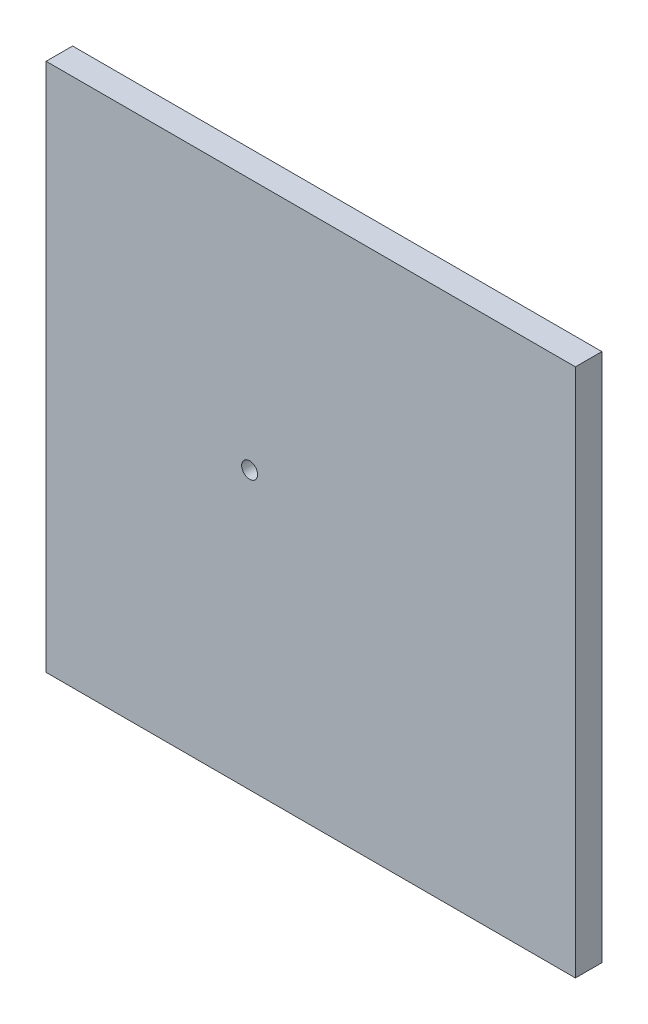
ISO-10303-21;
HEADER;
FILE_DESCRIPTION(('STEP AP214'),'2;1');
FILE_NAME('part.step','',(''),(''),'','','');
FILE_SCHEMA(('AUTOMOTIVE_DESIGN { 1 0 10303 214 1 1 1 1 }'));
ENDSEC;
DATA;
#1=APPLICATION_CONTEXT('core data for automotive mechanical design processes');
#2=APPLICATION_PROTOCOL_DEFINITION('international standard','automotive_design',2000,#1);
#3=PRODUCT_CONTEXT('',#1,'mechanical');
#4=PRODUCT('Part','Part','',(#3));
#5=PRODUCT_RELATED_PRODUCT_CATEGORY('part','',(#4));
#6=PRODUCT_DEFINITION_FORMATION('','',#4);
#7=PRODUCT_DEFINITION_CONTEXT('part definition',#1,'design');
#8=PRODUCT_DEFINITION('design','',#6,#7);
#9=PRODUCT_DEFINITION_SHAPE('','',#8);
#10=(LENGTH_UNIT() NAMED_UNIT(*) SI_UNIT(.MILLI.,.METRE.));
#11=(NAMED_UNIT(*) PLANE_ANGLE_UNIT() SI_UNIT($,.RADIAN.));
#12=(NAMED_UNIT(*) SI_UNIT($,.STERADIAN.) SOLID_ANGLE_UNIT());
#13=UNCERTAINTY_MEASURE_WITH_UNIT(LENGTH_MEASURE(1.E-05),#10,'distance_accuracy_value','');
#14=(GEOMETRIC_REPRESENTATION_CONTEXT(3) GLOBAL_UNCERTAINTY_ASSIGNED_CONTEXT((#13)) GLOBAL_UNIT_ASSIGNED_CONTEXT((#10,
#11,#12)) REPRESENTATION_CONTEXT('',''));
#15=CARTESIAN_POINT('',(0.,0.,0.));
#16=DIRECTION('',(0.,0.,1.));
#17=DIRECTION('',(1.,0.,0.));
#18=AXIS2_PLACEMENT_3D('',#15,#16,#17);
#19=CARTESIAN_POINT('',(127.,-127.,12.7));
#20=DIRECTION('',(-1.,0.,0.));
#21=DIRECTION('',(0.,0.,1.));
#22=AXIS2_PLACEMENT_3D('',#19,#20,#21);
#23=PLANE('',#22);
#24=DIRECTION('',(0.,1.,0.));
#25=VECTOR('',#24,1.);
#26=CARTESIAN_POINT('',(127.,-127.,0.));
#27=LINE('',#26,#25);
#28=CARTESIAN_POINT('',(127.,-127.,0.));
#29=VERTEX_POINT('',#28);
#30=CARTESIAN_POINT('',(127.,127.,0.));
#31=VERTEX_POINT('',#30);
#32=EDGE_CURVE('E112',#29,#31,#27,.T.);
#33=ORIENTED_EDGE('',*,*,#32,.T.);
#34=DIRECTION('',(0.,0.,-1.));
#35=VECTOR('',#34,1.);
#36=CARTESIAN_POINT('',(127.,127.,12.7));
#37=LINE('',#36,#35);
#38=CARTESIAN_POINT('',(127.,127.,12.7));
#39=VERTEX_POINT('',#38);
#40=EDGE_CURVE('E11',#39,#31,#37,.T.);
#41=ORIENTED_EDGE('',*,*,#40,.F.);
#42=DIRECTION('',(0.,1.,0.));
#43=VECTOR('',#42,1.);
#44=CARTESIAN_POINT('',(127.,-127.,12.7));
#45=LINE('',#44,#43);
#46=CARTESIAN_POINT('',(127.,-127.,12.7));
#47=VERTEX_POINT('',#46);
#48=EDGE_CURVE('E96',#47,#39,#45,.T.);
#49=ORIENTED_EDGE('',*,*,#48,.F.);
#50=DIRECTION('',(0.,0.,-1.));
#51=VECTOR('',#50,1.);
#52=CARTESIAN_POINT('',(127.,-127.,12.7));
#53=LINE('',#52,#51);
#54=EDGE_CURVE('E108',#47,#29,#53,.T.);
#55=ORIENTED_EDGE('',*,*,#54,.T.);
#56=EDGE_LOOP('',(#33,#41,#49,#55));
#57=FACE_BOUND('',#56,.T.);
#58=ADVANCED_FACE('F44',(#57),#23,.F.);
#59=CARTESIAN_POINT('',(-127.,127.,12.7));
#60=DIRECTION('',(0.,-1.,0.));
#61=DIRECTION('',(0.,0.,-1.));
#62=AXIS2_PLACEMENT_3D('',#59,#60,#61);
#63=PLANE('',#62);
#64=DIRECTION('',(-1.,0.,0.));
#65=VECTOR('',#64,1.);
#66=CARTESIAN_POINT('',(-127.,127.,0.));
#67=LINE('',#66,#65);
#68=CARTESIAN_POINT('',(-127.,127.,0.));
#69=VERTEX_POINT('',#68);
#70=EDGE_CURVE('E101',#31,#69,#67,.T.);
#71=ORIENTED_EDGE('',*,*,#70,.T.);
#72=DIRECTION('',(0.,0.,-1.));
#73=VECTOR('',#72,1.);
#74=CARTESIAN_POINT('',(-127.,127.,12.7));
#75=LINE('',#74,#73);
#76=CARTESIAN_POINT('',(-127.,127.,12.7));
#77=VERTEX_POINT('',#76);
#78=EDGE_CURVE('E53',#77,#69,#75,.T.);
#79=ORIENTED_EDGE('',*,*,#78,.F.);
#80=DIRECTION('',(-1.,0.,0.));
#81=VECTOR('',#80,1.);
#82=CARTESIAN_POINT('',(-127.,127.,12.7));
#83=LINE('',#82,#81);
#84=EDGE_CURVE('E91',#39,#77,#83,.T.);
#85=ORIENTED_EDGE('',*,*,#84,.F.);
#86=ORIENTED_EDGE('',*,*,#40,.T.);
#87=EDGE_LOOP('',(#71,#79,#85,#86));
#88=FACE_BOUND('',#87,.T.);
#89=ADVANCED_FACE('F100',(#88),#63,.F.);
#90=CARTESIAN_POINT('',(-127.,-127.,12.7));
#91=DIRECTION('',(1.,0.,0.));
#92=DIRECTION('',(0.,0.,-1.));
#93=AXIS2_PLACEMENT_3D('',#90,#91,#92);
#94=PLANE('',#93);
#95=DIRECTION('',(0.,-1.,0.));
#96=VECTOR('',#95,1.);
#97=CARTESIAN_POINT('',(-127.,-127.,0.));
#98=LINE('',#97,#96);
#99=CARTESIAN_POINT('',(-127.,-127.,0.));
#100=VERTEX_POINT('',#99);
#101=EDGE_CURVE('E78',#69,#100,#98,.T.);
#102=ORIENTED_EDGE('',*,*,#101,.T.);
#103=DIRECTION('',(0.,0.,-1.));
#104=VECTOR('',#103,1.);
#105=CARTESIAN_POINT('',(-127.,-127.,12.7));
#106=LINE('',#105,#104);
#107=CARTESIAN_POINT('',(-127.,-127.,12.7));
#108=VERTEX_POINT('',#107);
#109=EDGE_CURVE('E103',#108,#100,#106,.T.);
#110=ORIENTED_EDGE('',*,*,#109,.F.);
#111=DIRECTION('',(0.,-1.,0.));
#112=VECTOR('',#111,1.);
#113=CARTESIAN_POINT('',(-127.,-127.,12.7));
#114=LINE('',#113,#112);
#115=EDGE_CURVE('E94',#77,#108,#114,.T.);
#116=ORIENTED_EDGE('',*,*,#115,.F.);
#117=ORIENTED_EDGE('',*,*,#78,.T.);
#118=EDGE_LOOP('',(#102,#110,#116,#117));
#119=FACE_BOUND('',#118,.T.);
#120=ADVANCED_FACE('F104',(#119),#94,.F.);
#121=CARTESIAN_POINT('',(-127.,-127.,12.7));
#122=DIRECTION('',(0.,1.,0.));
#123=DIRECTION('',(0.,0.,1.));
#124=AXIS2_PLACEMENT_3D('',#121,#122,#123);
#125=PLANE('',#124);
#126=DIRECTION('',(1.,0.,0.));
#127=VECTOR('',#126,1.);
#128=CARTESIAN_POINT('',(-127.,-127.,0.));
#129=LINE('',#128,#127);
#130=EDGE_CURVE('E84',#100,#29,#129,.T.);
#131=ORIENTED_EDGE('',*,*,#130,.T.);
#132=ORIENTED_EDGE('',*,*,#54,.F.);
#133=DIRECTION('',(1.,0.,0.));
#134=VECTOR('',#133,1.);
#135=CARTESIAN_POINT('',(-127.,-127.,12.7));
#136=LINE('',#135,#134);
#137=EDGE_CURVE('E61',#108,#47,#136,.T.);
#138=ORIENTED_EDGE('',*,*,#137,.F.);
#139=ORIENTED_EDGE('',*,*,#109,.T.);
#140=EDGE_LOOP('',(#131,#132,#138,#139));
#141=FACE_BOUND('',#140,.T.);
#142=ADVANCED_FACE('F126',(#141),#125,.F.);
#143=CARTESIAN_POINT('',(0.,0.,12.7));
#144=DIRECTION('',(0.,0.,-1.));
#145=DIRECTION('',(-1.,0.,0.));
#146=AXIS2_PLACEMENT_3D('',#143,#144,#145);
#147=PLANE('',#146);
#148=CARTESIAN_POINT('',(-29.3427851968542,5.95360859066609,12.7));
#149=DIRECTION('',(0.,0.,1.));
#150=DIRECTION('',(1.,0.,0.));
#151=AXIS2_PLACEMENT_3D('',#148,#149,#150);
#152=CIRCLE('',#151,3.82731980828535);
#153=CARTESIAN_POINT('',(-25.5154653885688,5.95360859066609,12.7));
#154=VERTEX_POINT('',#153);
#155=EDGE_CURVE('E133',#154,#154,#152,.T.);
#156=ORIENTED_EDGE('',*,*,#155,.F.);
#157=EDGE_LOOP('',(#156));
#158=FACE_BOUND('',#157,.T.);
#159=ORIENTED_EDGE('',*,*,#48,.T.);
#160=ORIENTED_EDGE('',*,*,#84,.T.);
#161=ORIENTED_EDGE('',*,*,#115,.T.);
#162=ORIENTED_EDGE('',*,*,#137,.T.);
#163=EDGE_LOOP('',(#159,#160,#161,#162));
#164=FACE_BOUND('',#163,.T.);
#165=ADVANCED_FACE('F92',(#158,#164),#147,.F.);
#166=CARTESIAN_POINT('',(0.,0.,0.));
#167=DIRECTION('',(0.,0.,-1.));
#168=DIRECTION('',(-1.,0.,0.));
#169=AXIS2_PLACEMENT_3D('',#166,#167,#168);
#170=PLANE('',#169);
#171=CARTESIAN_POINT('',(-29.3427851968542,5.95360859066609,0.));
#172=DIRECTION('',(0.,0.,1.));
#173=DIRECTION('',(1.,0.,0.));
#174=AXIS2_PLACEMENT_3D('',#171,#172,#173);
#175=CIRCLE('',#174,3.82731980828535);
#176=CARTESIAN_POINT('',(-25.5154653885688,5.95360859066609,0.));
#177=VERTEX_POINT('',#176);
#178=EDGE_CURVE('E116',#177,#177,#175,.T.);
#179=ORIENTED_EDGE('',*,*,#178,.T.);
#180=EDGE_LOOP('',(#179));
#181=FACE_BOUND('',#180,.T.);
#182=ORIENTED_EDGE('',*,*,#32,.F.);
#183=ORIENTED_EDGE('',*,*,#130,.F.);
#184=ORIENTED_EDGE('',*,*,#101,.F.);
#185=ORIENTED_EDGE('',*,*,#70,.F.);
#186=EDGE_LOOP('',(#182,#183,#184,#185));
#187=FACE_BOUND('',#186,.T.);
#188=ADVANCED_FACE('F129',(#181,#187),#170,.T.);
#189=CARTESIAN_POINT('',(-29.3427851968542,5.95360859066609,0.));
#190=DIRECTION('',(0.,0.,1.));
#191=DIRECTION('',(1.,0.,0.));
#192=AXIS2_PLACEMENT_3D('',#189,#190,#191);
#193=CYLINDRICAL_SURFACE('',#192,3.82731980828535);
#194=ORIENTED_EDGE('',*,*,#178,.F.);
#195=EDGE_LOOP('',(#194));
#196=FACE_BOUND('',#195,.T.);
#197=ORIENTED_EDGE('',*,*,#155,.T.);
#198=EDGE_LOOP('',(#197));
#199=FACE_BOUND('',#198,.T.);
#200=ADVANCED_FACE('F142',(#196,#199),#193,.F.);
#201=CLOSED_SHELL('',(#58,#89,#120,#142,#165,#188,#200));
#202=MANIFOLD_SOLID_BREP('B2',#201);
#203=ADVANCED_BREP_SHAPE_REPRESENTATION('',(#18,#202),#14);
#204=SHAPE_DEFINITION_REPRESENTATION(#9,#203);
ENDSEC;
END-ISO-10303-21;
